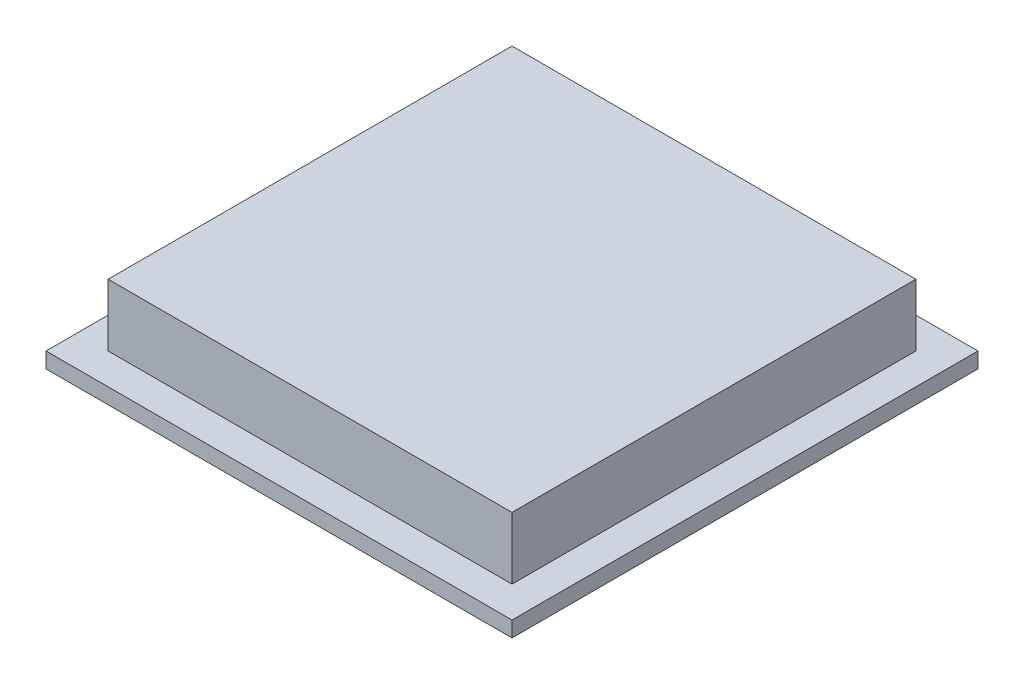
ISO-10303-21;
HEADER;
FILE_DESCRIPTION(('STEP AP214'),'2;1');
FILE_NAME('part.step','',(''),(''),'','','');
FILE_SCHEMA(('AUTOMOTIVE_DESIGN { 1 0 10303 214 1 1 1 1 }'));
ENDSEC;
DATA;
#1=APPLICATION_CONTEXT('core data for automotive mechanical design processes');
#2=APPLICATION_PROTOCOL_DEFINITION('international standard','automotive_design',2000,#1);
#3=PRODUCT_CONTEXT('',#1,'mechanical');
#4=PRODUCT('Part','Part','',(#3));
#5=PRODUCT_RELATED_PRODUCT_CATEGORY('part','',(#4));
#6=PRODUCT_DEFINITION_FORMATION('','',#4);
#7=PRODUCT_DEFINITION_CONTEXT('part definition',#1,'design');
#8=PRODUCT_DEFINITION('design','',#6,#7);
#9=PRODUCT_DEFINITION_SHAPE('','',#8);
#10=(LENGTH_UNIT() NAMED_UNIT(*) SI_UNIT(.MILLI.,.METRE.));
#11=(NAMED_UNIT(*) PLANE_ANGLE_UNIT() SI_UNIT($,.RADIAN.));
#12=(NAMED_UNIT(*) SI_UNIT($,.STERADIAN.) SOLID_ANGLE_UNIT());
#13=UNCERTAINTY_MEASURE_WITH_UNIT(LENGTH_MEASURE(1.E-05),#10,'distance_accuracy_value','');
#14=(GEOMETRIC_REPRESENTATION_CONTEXT(3) GLOBAL_UNCERTAINTY_ASSIGNED_CONTEXT((#13)) GLOBAL_UNIT_ASSIGNED_CONTEXT((#10,
#11,#12)) REPRESENTATION_CONTEXT('',''));
#15=CARTESIAN_POINT('',(0.,0.,0.));
#16=DIRECTION('',(0.,0.,1.));
#17=DIRECTION('',(1.,0.,0.));
#18=AXIS2_PLACEMENT_3D('',#15,#16,#17);
#19=CARTESIAN_POINT('',(19.05,6.35,19.05));
#20=DIRECTION('',(-1.,0.,0.));
#21=DIRECTION('',(0.,0.,1.));
#22=AXIS2_PLACEMENT_3D('',#19,#20,#21);
#23=PLANE('',#22);
#24=DIRECTION('',(0.,0.,-1.));
#25=VECTOR('',#24,1.);
#26=CARTESIAN_POINT('',(19.05,1.27,0.));
#27=LINE('',#26,#25);
#28=CARTESIAN_POINT('',(19.05,1.27,19.05));
#29=VERTEX_POINT('',#28);
#30=CARTESIAN_POINT('',(19.05,1.27,-19.05));
#31=VERTEX_POINT('',#30);
#32=EDGE_CURVE('E111',#29,#31,#27,.T.);
#33=ORIENTED_EDGE('',*,*,#32,.F.);
#34=DIRECTION('',(0.,-1.,0.));
#35=VECTOR('',#34,1.);
#36=CARTESIAN_POINT('',(19.05,6.35,19.05));
#37=LINE('',#36,#35);
#38=CARTESIAN_POINT('',(19.05,0.,19.05));
#39=VERTEX_POINT('',#38);
#40=EDGE_CURVE('E122',#29,#39,#37,.T.);
#41=ORIENTED_EDGE('',*,*,#40,.T.);
#42=DIRECTION('',(0.,0.,-1.));
#43=VECTOR('',#42,1.);
#44=CARTESIAN_POINT('',(19.05,0.,19.05));
#45=LINE('',#44,#43);
#46=CARTESIAN_POINT('',(19.05,0.,-19.05));
#47=VERTEX_POINT('',#46);
#48=EDGE_CURVE('E330',#39,#47,#45,.T.);
#49=ORIENTED_EDGE('',*,*,#48,.T.);
#50=DIRECTION('',(0.,-1.,0.));
#51=VECTOR('',#50,1.);
#52=CARTESIAN_POINT('',(19.05,6.35,-19.05));
#53=LINE('',#52,#51);
#54=EDGE_CURVE('E124',#31,#47,#53,.T.);
#55=ORIENTED_EDGE('',*,*,#54,.F.);
#56=EDGE_LOOP('',(#33,#41,#49,#55));
#57=FACE_BOUND('',#56,.T.);
#58=ADVANCED_FACE('F43',(#57),#23,.F.);
#59=CARTESIAN_POINT('',(-19.05,6.35,-19.05));
#60=DIRECTION('',(0.,0.,1.));
#61=DIRECTION('',(1.,0.,0.));
#62=AXIS2_PLACEMENT_3D('',#59,#60,#61);
#63=PLANE('',#62);
#64=DIRECTION('',(-1.,0.,0.));
#65=VECTOR('',#64,1.);
#66=CARTESIAN_POINT('',(0.,1.27,-19.05));
#67=LINE('',#66,#65);
#68=CARTESIAN_POINT('',(-19.05,1.27,-19.05));
#69=VERTEX_POINT('',#68);
#70=EDGE_CURVE('E126',#31,#69,#67,.T.);
#71=ORIENTED_EDGE('',*,*,#70,.F.);
#72=ORIENTED_EDGE('',*,*,#54,.T.);
#73=DIRECTION('',(-1.,0.,0.));
#74=VECTOR('',#73,1.);
#75=CARTESIAN_POINT('',(-19.05,0.,-19.05));
#76=LINE('',#75,#74);
#77=CARTESIAN_POINT('',(-19.05,0.,-19.05));
#78=VERTEX_POINT('',#77);
#79=EDGE_CURVE('E341',#47,#78,#76,.T.);
#80=ORIENTED_EDGE('',*,*,#79,.T.);
#81=DIRECTION('',(0.,-1.,0.));
#82=VECTOR('',#81,1.);
#83=CARTESIAN_POINT('',(-19.05,6.35,-19.05));
#84=LINE('',#83,#82);
#85=EDGE_CURVE('E138',#69,#78,#84,.T.);
#86=ORIENTED_EDGE('',*,*,#85,.F.);
#87=EDGE_LOOP('',(#71,#72,#80,#86));
#88=FACE_BOUND('',#87,.T.);
#89=ADVANCED_FACE('F172',(#88),#63,.F.);
#90=CARTESIAN_POINT('',(-19.05,6.35,19.05));
#91=DIRECTION('',(1.,0.,0.));
#92=DIRECTION('',(0.,0.,-1.));
#93=AXIS2_PLACEMENT_3D('',#90,#91,#92);
#94=PLANE('',#93);
#95=DIRECTION('',(0.,0.,1.));
#96=VECTOR('',#95,1.);
#97=CARTESIAN_POINT('',(-19.05,1.27,0.));
#98=LINE('',#97,#96);
#99=CARTESIAN_POINT('',(-19.05,1.27,19.05));
#100=VERTEX_POINT('',#99);
#101=EDGE_CURVE('E59',#69,#100,#98,.T.);
#102=ORIENTED_EDGE('',*,*,#101,.F.);
#103=ORIENTED_EDGE('',*,*,#85,.T.);
#104=DIRECTION('',(0.,0.,1.));
#105=VECTOR('',#104,1.);
#106=CARTESIAN_POINT('',(-19.05,0.,19.05));
#107=LINE('',#106,#105);
#108=CARTESIAN_POINT('',(-19.05,0.,19.05));
#109=VERTEX_POINT('',#108);
#110=EDGE_CURVE('E140',#78,#109,#107,.T.);
#111=ORIENTED_EDGE('',*,*,#110,.T.);
#112=DIRECTION('',(0.,-1.,0.));
#113=VECTOR('',#112,1.);
#114=CARTESIAN_POINT('',(-19.05,6.35,19.05));
#115=LINE('',#114,#113);
#116=EDGE_CURVE('E133',#100,#109,#115,.T.);
#117=ORIENTED_EDGE('',*,*,#116,.F.);
#118=EDGE_LOOP('',(#102,#103,#111,#117));
#119=FACE_BOUND('',#118,.T.);
#120=ADVANCED_FACE('F177',(#119),#94,.F.);
#121=CARTESIAN_POINT('',(-19.05,6.35,19.05));
#122=DIRECTION('',(0.,0.,-1.));
#123=DIRECTION('',(-1.,0.,0.));
#124=AXIS2_PLACEMENT_3D('',#121,#122,#123);
#125=PLANE('',#124);
#126=DIRECTION('',(1.,0.,0.));
#127=VECTOR('',#126,1.);
#128=CARTESIAN_POINT('',(0.,1.27,19.05));
#129=LINE('',#128,#127);
#130=EDGE_CURVE('E107',#100,#29,#129,.T.);
#131=ORIENTED_EDGE('',*,*,#130,.F.);
#132=ORIENTED_EDGE('',*,*,#116,.T.);
#133=DIRECTION('',(1.,0.,0.));
#134=VECTOR('',#133,1.);
#135=CARTESIAN_POINT('',(-19.05,0.,19.05));
#136=LINE('',#135,#134);
#137=EDGE_CURVE('E130',#109,#39,#136,.T.);
#138=ORIENTED_EDGE('',*,*,#137,.T.);
#139=ORIENTED_EDGE('',*,*,#40,.F.);
#140=EDGE_LOOP('',(#131,#132,#138,#139));
#141=FACE_BOUND('',#140,.T.);
#142=ADVANCED_FACE('F128',(#141),#125,.F.);
#143=CARTESIAN_POINT('',(0.,0.,0.));
#144=DIRECTION('',(0.,-1.,0.));
#145=DIRECTION('',(0.,0.,-1.));
#146=AXIS2_PLACEMENT_3D('',#143,#144,#145);
#147=PLANE('',#146);
#148=CARTESIAN_POINT('',(0.,0.,0.));
#149=DIRECTION('',(0.,-1.,0.));
#150=DIRECTION('',(0.,0.,-1.));
#151=AXIS2_PLACEMENT_3D('',#148,#149,#150);
#152=CIRCLE('',#151,12.787);
#153=CARTESIAN_POINT('',(0.,0.,-12.787));
#154=VERTEX_POINT('',#153);
#155=EDGE_CURVE('E11',#154,#154,#152,.F.);
#156=ORIENTED_EDGE('',*,*,#155,.T.);
#157=EDGE_LOOP('',(#156));
#158=FACE_BOUND('',#157,.T.);
#159=ORIENTED_EDGE('',*,*,#48,.F.);
#160=ORIENTED_EDGE('',*,*,#137,.F.);
#161=ORIENTED_EDGE('',*,*,#110,.F.);
#162=ORIENTED_EDGE('',*,*,#79,.F.);
#163=EDGE_LOOP('',(#159,#160,#161,#162));
#164=FACE_BOUND('',#163,.T.);
#165=ADVANCED_FACE('F186',(#158,#164),#147,.T.);
#166=CARTESIAN_POINT('',(-16.51,1.27,0.));
#167=DIRECTION('',(-1.,0.,0.));
#168=DIRECTION('',(0.,0.,1.));
#169=AXIS2_PLACEMENT_3D('',#166,#167,#168);
#170=PLANE('',#169);
#171=DIRECTION('',(0.,0.,1.));
#172=VECTOR('',#171,1.);
#173=CARTESIAN_POINT('',(-16.51,6.35,0.));
#174=LINE('',#173,#172);
#175=CARTESIAN_POINT('',(-16.51,6.35,-16.51));
#176=VERTEX_POINT('',#175);
#177=CARTESIAN_POINT('',(-16.51,6.35,16.51));
#178=VERTEX_POINT('',#177);
#179=EDGE_CURVE('E67',#176,#178,#174,.T.);
#180=ORIENTED_EDGE('',*,*,#179,.F.);
#181=DIRECTION('',(0.,1.,0.));
#182=VECTOR('',#181,1.);
#183=CARTESIAN_POINT('',(-16.51,1.27,-16.51));
#184=LINE('',#183,#182);
#185=CARTESIAN_POINT('',(-16.51,1.27,-16.51));
#186=VERTEX_POINT('',#185);
#187=EDGE_CURVE('E336',#186,#176,#184,.T.);
#188=ORIENTED_EDGE('',*,*,#187,.F.);
#189=DIRECTION('',(0.,0.,1.));
#190=VECTOR('',#189,1.);
#191=CARTESIAN_POINT('',(-16.51,1.27,0.));
#192=LINE('',#191,#190);
#193=CARTESIAN_POINT('',(-16.51,1.27,16.51));
#194=VERTEX_POINT('',#193);
#195=EDGE_CURVE('E353',#186,#194,#192,.T.);
#196=ORIENTED_EDGE('',*,*,#195,.T.);
#197=DIRECTION('',(0.,1.,0.));
#198=VECTOR('',#197,1.);
#199=CARTESIAN_POINT('',(-16.51,1.27,16.51));
#200=LINE('',#199,#198);
#201=EDGE_CURVE('E307',#194,#178,#200,.T.);
#202=ORIENTED_EDGE('',*,*,#201,.T.);
#203=EDGE_LOOP('',(#180,#188,#196,#202));
#204=FACE_BOUND('',#203,.T.);
#205=ADVANCED_FACE('F189',(#204),#170,.T.);
#206=CARTESIAN_POINT('',(0.,1.27,16.51));
#207=DIRECTION('',(0.,0.,-1.));
#208=DIRECTION('',(-1.,0.,0.));
#209=AXIS2_PLACEMENT_3D('',#206,#207,#208);
#210=PLANE('',#209);
#211=DIRECTION('',(-1.,0.,0.));
#212=VECTOR('',#211,1.);
#213=CARTESIAN_POINT('',(0.,6.35,16.51));
#214=LINE('',#213,#212);
#215=CARTESIAN_POINT('',(16.51,6.35,16.51));
#216=VERTEX_POINT('',#215);
#217=EDGE_CURVE('E117',#216,#178,#214,.T.);
#218=ORIENTED_EDGE('',*,*,#217,.T.);
#219=ORIENTED_EDGE('',*,*,#201,.F.);
#220=DIRECTION('',(-1.,0.,0.));
#221=VECTOR('',#220,1.);
#222=CARTESIAN_POINT('',(0.,1.27,16.51));
#223=LINE('',#222,#221);
#224=CARTESIAN_POINT('',(16.51,1.27,16.51));
#225=VERTEX_POINT('',#224);
#226=EDGE_CURVE('E323',#225,#194,#223,.T.);
#227=ORIENTED_EDGE('',*,*,#226,.F.);
#228=DIRECTION('',(0.,1.,0.));
#229=VECTOR('',#228,1.);
#230=CARTESIAN_POINT('',(16.51,1.27,16.51));
#231=LINE('',#230,#229);
#232=EDGE_CURVE('E309',#225,#216,#231,.T.);
#233=ORIENTED_EDGE('',*,*,#232,.T.);
#234=EDGE_LOOP('',(#218,#219,#227,#233));
#235=FACE_BOUND('',#234,.T.);
#236=ADVANCED_FACE('F197',(#235),#210,.F.);
#237=CARTESIAN_POINT('',(16.51,1.27,0.));
#238=DIRECTION('',(-1.,0.,0.));
#239=DIRECTION('',(0.,0.,1.));
#240=AXIS2_PLACEMENT_3D('',#237,#238,#239);
#241=PLANE('',#240);
#242=DIRECTION('',(0.,0.,1.));
#243=VECTOR('',#242,1.);
#244=CARTESIAN_POINT('',(16.51,6.35,0.));
#245=LINE('',#244,#243);
#246=CARTESIAN_POINT('',(16.51,6.35,-16.51));
#247=VERTEX_POINT('',#246);
#248=EDGE_CURVE('E313',#247,#216,#245,.T.);
#249=ORIENTED_EDGE('',*,*,#248,.T.);
#250=ORIENTED_EDGE('',*,*,#232,.F.);
#251=DIRECTION('',(0.,0.,1.));
#252=VECTOR('',#251,1.);
#253=CARTESIAN_POINT('',(16.51,1.27,0.));
#254=LINE('',#253,#252);
#255=CARTESIAN_POINT('',(16.51,1.27,-16.51));
#256=VERTEX_POINT('',#255);
#257=EDGE_CURVE('E361',#256,#225,#254,.T.);
#258=ORIENTED_EDGE('',*,*,#257,.F.);
#259=DIRECTION('',(0.,1.,0.));
#260=VECTOR('',#259,1.);
#261=CARTESIAN_POINT('',(16.51,1.27,-16.51));
#262=LINE('',#261,#260);
#263=EDGE_CURVE('E333',#256,#247,#262,.T.);
#264=ORIENTED_EDGE('',*,*,#263,.T.);
#265=EDGE_LOOP('',(#249,#250,#258,#264));
#266=FACE_BOUND('',#265,.T.);
#267=ADVANCED_FACE('F201',(#266),#241,.F.);
#268=CARTESIAN_POINT('',(0.,1.27,-16.51));
#269=DIRECTION('',(0.,0.,1.));
#270=DIRECTION('',(1.,0.,0.));
#271=AXIS2_PLACEMENT_3D('',#268,#269,#270);
#272=PLANE('',#271);
#273=DIRECTION('',(1.,0.,0.));
#274=VECTOR('',#273,1.);
#275=CARTESIAN_POINT('',(0.,6.35,-16.51));
#276=LINE('',#275,#274);
#277=EDGE_CURVE('E317',#176,#247,#276,.T.);
#278=ORIENTED_EDGE('',*,*,#277,.T.);
#279=ORIENTED_EDGE('',*,*,#263,.F.);
#280=DIRECTION('',(1.,0.,0.));
#281=VECTOR('',#280,1.);
#282=CARTESIAN_POINT('',(0.,1.27,-16.51));
#283=LINE('',#282,#281);
#284=EDGE_CURVE('E358',#186,#256,#283,.T.);
#285=ORIENTED_EDGE('',*,*,#284,.F.);
#286=ORIENTED_EDGE('',*,*,#187,.T.);
#287=EDGE_LOOP('',(#278,#279,#285,#286));
#288=FACE_BOUND('',#287,.T.);
#289=ADVANCED_FACE('F198',(#288),#272,.F.);
#290=CARTESIAN_POINT('',(0.,1.27,0.));
#291=DIRECTION('',(0.,1.,0.));
#292=DIRECTION('',(0.,0.,1.));
#293=AXIS2_PLACEMENT_3D('',#290,#291,#292);
#294=PLANE('',#293);
#295=ORIENTED_EDGE('',*,*,#130,.T.);
#296=ORIENTED_EDGE('',*,*,#32,.T.);
#297=ORIENTED_EDGE('',*,*,#70,.T.);
#298=ORIENTED_EDGE('',*,*,#101,.T.);
#299=EDGE_LOOP('',(#295,#296,#297,#298));
#300=FACE_BOUND('',#299,.T.);
#301=ORIENTED_EDGE('',*,*,#195,.F.);
#302=ORIENTED_EDGE('',*,*,#284,.T.);
#303=ORIENTED_EDGE('',*,*,#257,.T.);
#304=ORIENTED_EDGE('',*,*,#226,.T.);
#305=EDGE_LOOP('',(#301,#302,#303,#304));
#306=FACE_BOUND('',#305,.T.);
#307=ADVANCED_FACE('F109',(#300,#306),#294,.T.);
#308=CARTESIAN_POINT('',(0.,6.35,0.));
#309=DIRECTION('',(0.,-1.,0.));
#310=DIRECTION('',(0.,0.,-1.));
#311=AXIS2_PLACEMENT_3D('',#308,#309,#310);
#312=PLANE('',#311);
#313=ORIENTED_EDGE('',*,*,#179,.T.);
#314=ORIENTED_EDGE('',*,*,#217,.F.);
#315=ORIENTED_EDGE('',*,*,#248,.F.);
#316=ORIENTED_EDGE('',*,*,#277,.F.);
#317=EDGE_LOOP('',(#313,#314,#315,#316));
#318=FACE_BOUND('',#317,.T.);
#319=ADVANCED_FACE('F191',(#318),#312,.F.);
#320=CARTESIAN_POINT('',(0.,5.08,0.));
#321=DIRECTION('',(0.,-1.,0.));
#322=DIRECTION('',(0.,0.,-1.));
#323=AXIS2_PLACEMENT_3D('',#320,#321,#322);
#324=CYLINDRICAL_SURFACE('',#323,10.755);
#325=CARTESIAN_POINT('',(0.,2.032,0.));
#326=DIRECTION('',(0.,-1.,0.));
#327=DIRECTION('',(0.,0.,-1.));
#328=AXIS2_PLACEMENT_3D('',#325,#326,#327);
#329=CIRCLE('',#328,10.755);
#330=CARTESIAN_POINT('',(0.,2.032,-10.755));
#331=VERTEX_POINT('',#330);
#332=EDGE_CURVE('E52',#331,#331,#329,.T.);
#333=ORIENTED_EDGE('',*,*,#332,.T.);
#334=EDGE_LOOP('',(#333));
#335=FACE_BOUND('',#334,.T.);
#336=CARTESIAN_POINT('',(0.,3.048,0.));
#337=DIRECTION('',(0.,-1.,0.));
#338=DIRECTION('',(0.,0.,-1.));
#339=AXIS2_PLACEMENT_3D('',#336,#337,#338);
#340=CIRCLE('',#339,10.755);
#341=CARTESIAN_POINT('',(0.,3.048,-10.755));
#342=VERTEX_POINT('',#341);
#343=EDGE_CURVE('E152',#342,#342,#340,.F.);
#344=ORIENTED_EDGE('',*,*,#343,.T.);
#345=EDGE_LOOP('',(#344));
#346=FACE_BOUND('',#345,.T.);
#347=ADVANCED_FACE('F159',(#335,#346),#324,.F.);
#348=CARTESIAN_POINT('',(0.,5.08,0.));
#349=DIRECTION('',(0.,-1.,0.));
#350=DIRECTION('',(0.,0.,-1.));
#351=AXIS2_PLACEMENT_3D('',#348,#349,#350);
#352=PLANE('',#351);
#353=CARTESIAN_POINT('',(0.,5.08,0.));
#354=DIRECTION('',(0.,-1.,0.));
#355=DIRECTION('',(0.,0.,-1.));
#356=AXIS2_PLACEMENT_3D('',#353,#354,#355);
#357=CIRCLE('',#356,8.723);
#358=CARTESIAN_POINT('',(0.,5.08,-8.723));
#359=VERTEX_POINT('',#358);
#360=EDGE_CURVE('E148',#359,#359,#357,.T.);
#361=ORIENTED_EDGE('',*,*,#360,.T.);
#362=EDGE_LOOP('',(#361));
#363=FACE_BOUND('',#362,.T.);
#364=ADVANCED_FACE('F168',(#363),#352,.T.);
#365=CARTESIAN_POINT('',(0.,3.048,0.));
#366=DIRECTION('',(0.,-1.,0.));
#367=DIRECTION('',(0.,0.,-1.));
#368=AXIS2_PLACEMENT_3D('',#365,#366,#367);
#369=TOROIDAL_SURFACE('',#368,8.723,2.032);
#370=ORIENTED_EDGE('',*,*,#343,.F.);
#371=EDGE_LOOP('',(#370));
#372=FACE_BOUND('',#371,.T.);
#373=ORIENTED_EDGE('',*,*,#360,.F.);
#374=EDGE_LOOP('',(#373));
#375=FACE_BOUND('',#374,.T.);
#376=ADVANCED_FACE('F163',(#372,#375),#369,.F.);
#377=CARTESIAN_POINT('',(0.,2.032,0.));
#378=DIRECTION('',(0.,-1.,0.));
#379=DIRECTION('',(0.,0.,-1.));
#380=AXIS2_PLACEMENT_3D('',#377,#378,#379);
#381=TOROIDAL_SURFACE('',#380,12.787,2.032);
#382=ORIENTED_EDGE('',*,*,#155,.F.);
#383=EDGE_LOOP('',(#382));
#384=FACE_BOUND('',#383,.T.);
#385=ORIENTED_EDGE('',*,*,#332,.F.);
#386=EDGE_LOOP('',(#385));
#387=FACE_BOUND('',#386,.T.);
#388=ADVANCED_FACE('F45',(#384,#387),#381,.T.);
#389=CLOSED_SHELL('',(#58,#89,#120,#142,#165,#205,#236,#267,#289,#307,#319,#347,#364,#376,#388));
#390=MANIFOLD_SOLID_BREP('B2',#389);
#391=ADVANCED_BREP_SHAPE_REPRESENTATION('',(#18,#390),#14);
#392=SHAPE_DEFINITION_REPRESENTATION(#9,#391);
ENDSEC;
END-ISO-10303-21;
